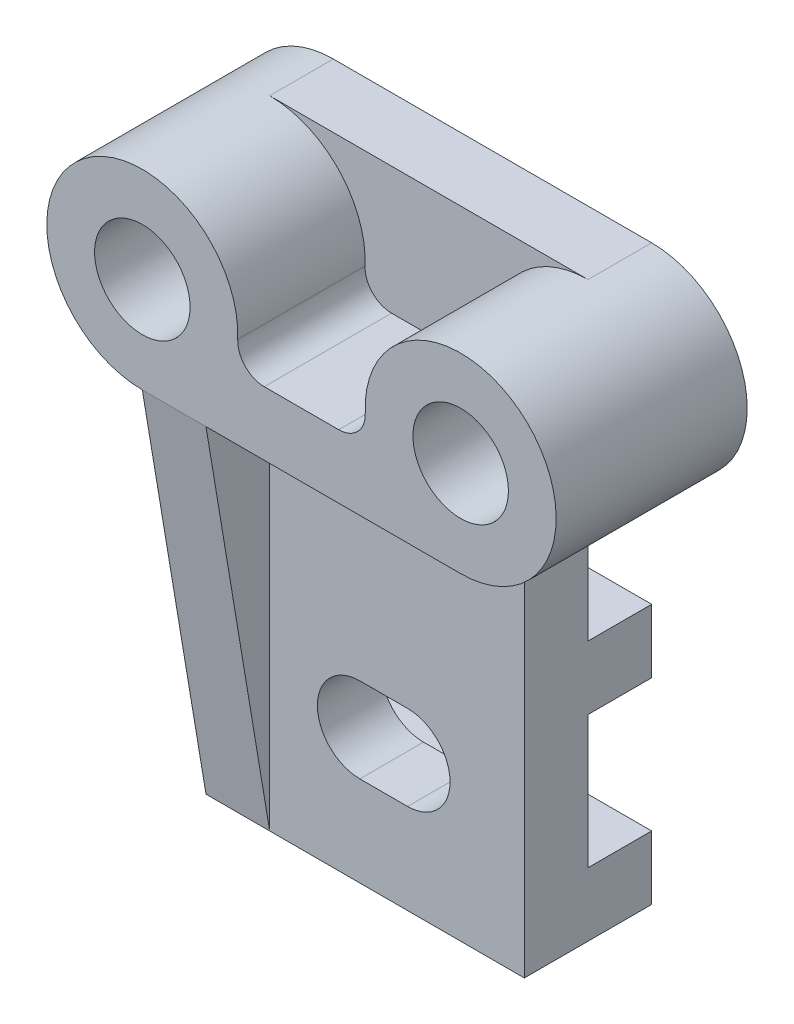
ISO-10303-21;
HEADER;
FILE_DESCRIPTION(('STEP AP214'),'2;1');
FILE_NAME('part.step','',(''),(''),'','','');
FILE_SCHEMA(('AUTOMOTIVE_DESIGN { 1 0 10303 214 1 1 1 1 }'));
ENDSEC;
DATA;
#1=APPLICATION_CONTEXT('core data for automotive mechanical design processes');
#2=APPLICATION_PROTOCOL_DEFINITION('international standard','automotive_design',2000,#1);
#3=PRODUCT_CONTEXT('',#1,'mechanical');
#4=PRODUCT('Part','Part','',(#3));
#5=PRODUCT_RELATED_PRODUCT_CATEGORY('part','',(#4));
#6=PRODUCT_DEFINITION_FORMATION('','',#4);
#7=PRODUCT_DEFINITION_CONTEXT('part definition',#1,'design');
#8=PRODUCT_DEFINITION('design','',#6,#7);
#9=PRODUCT_DEFINITION_SHAPE('','',#8);
#10=(LENGTH_UNIT() NAMED_UNIT(*) SI_UNIT(.MILLI.,.METRE.));
#11=(NAMED_UNIT(*) PLANE_ANGLE_UNIT() SI_UNIT($,.RADIAN.));
#12=(NAMED_UNIT(*) SI_UNIT($,.STERADIAN.) SOLID_ANGLE_UNIT());
#13=UNCERTAINTY_MEASURE_WITH_UNIT(LENGTH_MEASURE(1.E-05),#10,'distance_accuracy_value','');
#14=(GEOMETRIC_REPRESENTATION_CONTEXT(3) GLOBAL_UNCERTAINTY_ASSIGNED_CONTEXT((#13)) GLOBAL_UNIT_ASSIGNED_CONTEXT((#10,
#11,#12)) REPRESENTATION_CONTEXT('',''));
#15=CARTESIAN_POINT('',(0.,0.,0.));
#16=DIRECTION('',(0.,0.,1.));
#17=DIRECTION('',(1.,0.,0.));
#18=AXIS2_PLACEMENT_3D('',#15,#16,#17);
#19=CARTESIAN_POINT('',(0.,27.,36.));
#20=DIRECTION('',(0.,1.,0.));
#21=DIRECTION('',(-1.,0.,0.));
#22=AXIS2_PLACEMENT_3D('',#19,#20,#21);
#23=PLANE('',#22);
#24=DIRECTION('',(0.,0.,-1.));
#25=VECTOR('',#24,1.);
#26=CARTESIAN_POINT('',(-18.,27.,36.));
#27=LINE('',#26,#25);
#28=CARTESIAN_POINT('',(-18.,27.,36.));
#29=VERTEX_POINT('',#28);
#30=CARTESIAN_POINT('',(-18.,27.,24.));
#31=VERTEX_POINT('',#30);
#32=EDGE_CURVE('E411',#29,#31,#27,.T.);
#33=ORIENTED_EDGE('',*,*,#32,.T.);
#34=DIRECTION('',(1.,0.,0.));
#35=VECTOR('',#34,1.);
#36=CARTESIAN_POINT('',(0.,27.,24.));
#37=LINE('',#36,#35);
#38=CARTESIAN_POINT('',(30.,27.,24.));
#39=VERTEX_POINT('',#38);
#40=EDGE_CURVE('E363',#31,#39,#37,.T.);
#41=ORIENTED_EDGE('',*,*,#40,.T.);
#42=DIRECTION('',(0.,0.,-1.));
#43=VECTOR('',#42,1.);
#44=CARTESIAN_POINT('',(30.,27.,36.));
#45=LINE('',#44,#43);
#46=CARTESIAN_POINT('',(30.,27.,36.));
#47=VERTEX_POINT('',#46);
#48=EDGE_CURVE('E279',#47,#39,#45,.T.);
#49=ORIENTED_EDGE('',*,*,#48,.F.);
#50=DIRECTION('',(1.,0.,0.));
#51=VECTOR('',#50,1.);
#52=CARTESIAN_POINT('',(0.,27.,36.));
#53=LINE('',#52,#51);
#54=EDGE_CURVE('E276',#29,#47,#53,.T.);
#55=ORIENTED_EDGE('',*,*,#54,.F.);
#56=EDGE_LOOP('',(#33,#41,#49,#55));
#57=FACE_BOUND('',#56,.T.);
#58=ADVANCED_FACE('F49',(#57),#23,.F.);
#59=CARTESIAN_POINT('',(0.,0.,24.));
#60=DIRECTION('',(0.,0.,1.));
#61=DIRECTION('',(1.,0.,0.));
#62=AXIS2_PLACEMENT_3D('',#59,#60,#61);
#63=PLANE('',#62);
#64=CARTESIAN_POINT('',(-0.999999999999996,-20.,24.));
#65=DIRECTION('',(0.,0.,1.));
#66=DIRECTION('',(1.,0.,0.));
#67=AXIS2_PLACEMENT_3D('',#64,#65,#66);
#68=CIRCLE('',#67,8.);
#69=CARTESIAN_POINT('',(-1.,-12.,24.));
#70=VERTEX_POINT('',#69);
#71=CARTESIAN_POINT('',(-1.,-28.,24.));
#72=VERTEX_POINT('',#71);
#73=EDGE_CURVE('E366',#70,#72,#68,.T.);
#74=ORIENTED_EDGE('',*,*,#73,.F.);
#75=DIRECTION('',(-1.,0.,0.));
#76=VECTOR('',#75,1.);
#77=CARTESIAN_POINT('',(0.,-12.,24.));
#78=LINE('',#77,#76);
#79=CARTESIAN_POINT('',(8.,-12.,24.));
#80=VERTEX_POINT('',#79);
#81=EDGE_CURVE('E369',#80,#70,#78,.T.);
#82=ORIENTED_EDGE('',*,*,#81,.F.);
#83=CARTESIAN_POINT('',(8.,-20.,24.));
#84=DIRECTION('',(0.,0.,1.));
#85=DIRECTION('',(1.,0.,0.));
#86=AXIS2_PLACEMENT_3D('',#83,#84,#85);
#87=CIRCLE('',#86,8.);
#88=CARTESIAN_POINT('',(8.,-28.,24.));
#89=VERTEX_POINT('',#88);
#90=EDGE_CURVE('E373',#89,#80,#87,.T.);
#91=ORIENTED_EDGE('',*,*,#90,.F.);
#92=DIRECTION('',(1.,0.,0.));
#93=VECTOR('',#92,1.);
#94=CARTESIAN_POINT('',(0.,-28.,24.));
#95=LINE('',#94,#93);
#96=EDGE_CURVE('E376',#72,#89,#95,.T.);
#97=ORIENTED_EDGE('',*,*,#96,.F.);
#98=EDGE_LOOP('',(#74,#82,#91,#97));
#99=FACE_BOUND('',#98,.T.);
#100=ORIENTED_EDGE('',*,*,#40,.F.);
#101=DIRECTION('',(0.,1.,0.));
#102=VECTOR('',#101,1.);
#103=CARTESIAN_POINT('',(-18.,0.,24.));
#104=LINE('',#103,#102);
#105=CARTESIAN_POINT('',(-18.,-45.,24.));
#106=VERTEX_POINT('',#105);
#107=EDGE_CURVE('E407',#106,#31,#104,.T.);
#108=ORIENTED_EDGE('',*,*,#107,.F.);
#109=DIRECTION('',(-1.,0.,0.));
#110=VECTOR('',#109,1.);
#111=CARTESIAN_POINT('',(0.,-45.,24.));
#112=LINE('',#111,#110);
#113=CARTESIAN_POINT('',(30.,-45.,24.));
#114=VERTEX_POINT('',#113);
#115=EDGE_CURVE('E224',#114,#106,#112,.T.);
#116=ORIENTED_EDGE('',*,*,#115,.F.);
#117=DIRECTION('',(0.,-1.,0.));
#118=VECTOR('',#117,1.);
#119=CARTESIAN_POINT('',(30.,0.,24.));
#120=LINE('',#119,#118);
#121=EDGE_CURVE('E359',#39,#114,#120,.T.);
#122=ORIENTED_EDGE('',*,*,#121,.F.);
#123=EDGE_LOOP('',(#100,#108,#116,#122));
#124=FACE_BOUND('',#123,.T.);
#125=ADVANCED_FACE('F405',(#99,#124),#63,.T.);
#126=CARTESIAN_POINT('',(0.,0.,0.));
#127=DIRECTION('',(0.,0.,1.));
#128=DIRECTION('',(1.,0.,0.));
#129=AXIS2_PLACEMENT_3D('',#126,#127,#128);
#130=PLANE('',#129);
#131=DIRECTION('',(-1.,0.,0.));
#132=VECTOR('',#131,1.);
#133=CARTESIAN_POINT('',(0.,-8.,0.));
#134=LINE('',#133,#132);
#135=CARTESIAN_POINT('',(30.,-8.,0.));
#136=VERTEX_POINT('',#135);
#137=CARTESIAN_POINT('',(-30.,-8.00000000000001,0.));
#138=VERTEX_POINT('',#137);
#139=EDGE_CURVE('E421',#136,#138,#134,.T.);
#140=ORIENTED_EDGE('',*,*,#139,.T.);
#141=DIRECTION('',(0.,-1.,0.));
#142=VECTOR('',#141,1.);
#143=CARTESIAN_POINT('',(-30.,0.,0.));
#144=LINE('',#143,#142);
#145=CARTESIAN_POINT('',(-30.,4.,0.));
#146=VERTEX_POINT('',#145);
#147=EDGE_CURVE('E380',#146,#138,#144,.T.);
#148=ORIENTED_EDGE('',*,*,#147,.F.);
#149=DIRECTION('',(1.,0.,0.));
#150=VECTOR('',#149,1.);
#151=CARTESIAN_POINT('',(0.,4.,0.));
#152=LINE('',#151,#150);
#153=CARTESIAN_POINT('',(30.,4.,0.));
#154=VERTEX_POINT('',#153);
#155=EDGE_CURVE('E413',#146,#154,#152,.T.);
#156=ORIENTED_EDGE('',*,*,#155,.T.);
#157=DIRECTION('',(0.,-1.,0.));
#158=VECTOR('',#157,1.);
#159=CARTESIAN_POINT('',(30.,0.,0.));
#160=LINE('',#159,#158);
#161=EDGE_CURVE('E360',#154,#136,#160,.T.);
#162=ORIENTED_EDGE('',*,*,#161,.T.);
#163=EDGE_LOOP('',(#140,#148,#156,#162));
#164=FACE_BOUND('',#163,.T.);
#165=ADVANCED_FACE('F466',(#164),#130,.F.);
#166=CARTESIAN_POINT('',(-30.,-33.,0.));
#167=VERTEX_POINT('',#166);
#168=CARTESIAN_POINT('',(-30.,-45.,0.));
#169=VERTEX_POINT('',#168);
#170=EDGE_CURVE('E229',#167,#169,#144,.T.);
#171=ORIENTED_EDGE('',*,*,#170,.F.);
#172=DIRECTION('',(-1.,0.,0.));
#173=VECTOR('',#172,1.);
#174=CARTESIAN_POINT('',(0.,-33.,0.));
#175=LINE('',#174,#173);
#176=CARTESIAN_POINT('',(30.,-33.,0.));
#177=VERTEX_POINT('',#176);
#178=EDGE_CURVE('E356',#177,#167,#175,.T.);
#179=ORIENTED_EDGE('',*,*,#178,.F.);
#180=CARTESIAN_POINT('',(30.,-45.,0.));
#181=VERTEX_POINT('',#180);
#182=EDGE_CURVE('E384',#177,#181,#160,.T.);
#183=ORIENTED_EDGE('',*,*,#182,.T.);
#184=DIRECTION('',(-1.,0.,0.));
#185=VECTOR('',#184,1.);
#186=CARTESIAN_POINT('',(0.,-45.,0.));
#187=LINE('',#186,#185);
#188=EDGE_CURVE('E382',#181,#169,#187,.T.);
#189=ORIENTED_EDGE('',*,*,#188,.T.);
#190=EDGE_LOOP('',(#171,#179,#183,#189));
#191=FACE_BOUND('',#190,.T.);
#192=ADVANCED_FACE('F479',(#191),#130,.F.);
#193=CARTESIAN_POINT('',(-30.,0.,24.));
#194=DIRECTION('',(1.,0.,0.));
#195=DIRECTION('',(0.,1.,0.));
#196=AXIS2_PLACEMENT_3D('',#193,#194,#195);
#197=PLANE('',#196);
#198=DIRECTION('',(0.,0.,-1.));
#199=VECTOR('',#198,1.);
#200=CARTESIAN_POINT('',(-30.,-45.,24.));
#201=LINE('',#200,#199);
#202=CARTESIAN_POINT('',(-30.,-45.,24.));
#203=VERTEX_POINT('',#202);
#204=EDGE_CURVE('E221',#203,#169,#201,.T.);
#205=ORIENTED_EDGE('',*,*,#204,.F.);
#206=DIRECTION('',(0.,0.986393923832144,0.164398987305357));
#207=VECTOR('',#206,1.);
#208=CARTESIAN_POINT('',(-30.,-5.10810810810811,30.6486486486487));
#209=LINE('',#208,#207);
#210=CARTESIAN_POINT('',(-30.,27.,36.));
#211=VERTEX_POINT('',#210);
#212=EDGE_CURVE('E205',#203,#211,#209,.T.);
#213=ORIENTED_EDGE('',*,*,#212,.T.);
#214=DIRECTION('',(0.,0.,-1.));
#215=VECTOR('',#214,1.);
#216=CARTESIAN_POINT('',(-30.,27.,36.));
#217=LINE('',#216,#215);
#218=CARTESIAN_POINT('',(-30.,27.,12.));
#219=VERTEX_POINT('',#218);
#220=EDGE_CURVE('E292',#211,#219,#217,.T.);
#221=ORIENTED_EDGE('',*,*,#220,.T.);
#222=DIRECTION('',(0.,-1.,0.));
#223=VECTOR('',#222,1.);
#224=CARTESIAN_POINT('',(-30.,0.,12.));
#225=LINE('',#224,#223);
#226=CARTESIAN_POINT('',(-30.,4.,12.));
#227=VERTEX_POINT('',#226);
#228=EDGE_CURVE('E448',#219,#227,#225,.T.);
#229=ORIENTED_EDGE('',*,*,#228,.T.);
#230=DIRECTION('',(0.,0.,-1.));
#231=VECTOR('',#230,1.);
#232=CARTESIAN_POINT('',(-30.,4.,12.));
#233=LINE('',#232,#231);
#234=EDGE_CURVE('E353',#227,#146,#233,.T.);
#235=ORIENTED_EDGE('',*,*,#234,.T.);
#236=ORIENTED_EDGE('',*,*,#147,.T.);
#237=DIRECTION('',(0.,0.,-1.));
#238=VECTOR('',#237,1.);
#239=CARTESIAN_POINT('',(-30.,-8.00000000000001,12.));
#240=LINE('',#239,#238);
#241=CARTESIAN_POINT('',(-30.,-8.00000000000001,12.));
#242=VERTEX_POINT('',#241);
#243=EDGE_CURVE('E442',#242,#138,#240,.T.);
#244=ORIENTED_EDGE('',*,*,#243,.F.);
#245=DIRECTION('',(0.,-1.,0.));
#246=VECTOR('',#245,1.);
#247=CARTESIAN_POINT('',(-30.,0.,12.));
#248=LINE('',#247,#246);
#249=CARTESIAN_POINT('',(-30.,-33.,12.));
#250=VERTEX_POINT('',#249);
#251=EDGE_CURVE('E426',#242,#250,#248,.T.);
#252=ORIENTED_EDGE('',*,*,#251,.T.);
#253=DIRECTION('',(0.,0.,-1.));
#254=VECTOR('',#253,1.);
#255=CARTESIAN_POINT('',(-30.,-33.,12.));
#256=LINE('',#255,#254);
#257=EDGE_CURVE('E437',#250,#167,#256,.T.);
#258=ORIENTED_EDGE('',*,*,#257,.T.);
#259=ORIENTED_EDGE('',*,*,#170,.T.);
#260=EDGE_LOOP('',(#205,#213,#221,#229,#235,#236,#244,#252,#258,#259));
#261=FACE_BOUND('',#260,.T.);
#262=ADVANCED_FACE('F226',(#261),#197,.F.);
#263=CARTESIAN_POINT('',(30.,0.,24.));
#264=DIRECTION('',(1.,0.,0.));
#265=DIRECTION('',(0.,1.,0.));
#266=AXIS2_PLACEMENT_3D('',#263,#264,#265);
#267=PLANE('',#266);
#268=DIRECTION('',(0.,0.,-1.));
#269=VECTOR('',#268,1.);
#270=CARTESIAN_POINT('',(30.,-33.,12.));
#271=LINE('',#270,#269);
#272=CARTESIAN_POINT('',(30.,-33.,12.));
#273=VERTEX_POINT('',#272);
#274=EDGE_CURVE('E381',#273,#177,#271,.T.);
#275=ORIENTED_EDGE('',*,*,#274,.F.);
#276=DIRECTION('',(0.,-1.,0.));
#277=VECTOR('',#276,1.);
#278=CARTESIAN_POINT('',(30.,0.,12.));
#279=LINE('',#278,#277);
#280=CARTESIAN_POINT('',(30.,-8.,12.));
#281=VERTEX_POINT('',#280);
#282=EDGE_CURVE('E420',#281,#273,#279,.T.);
#283=ORIENTED_EDGE('',*,*,#282,.F.);
#284=DIRECTION('',(0.,0.,-1.));
#285=VECTOR('',#284,1.);
#286=CARTESIAN_POINT('',(30.,-8.,12.));
#287=LINE('',#286,#285);
#288=EDGE_CURVE('E444',#281,#136,#287,.T.);
#289=ORIENTED_EDGE('',*,*,#288,.T.);
#290=ORIENTED_EDGE('',*,*,#161,.F.);
#291=DIRECTION('',(0.,0.,-1.));
#292=VECTOR('',#291,1.);
#293=CARTESIAN_POINT('',(30.,4.,12.));
#294=LINE('',#293,#292);
#295=CARTESIAN_POINT('',(30.,4.,12.));
#296=VERTEX_POINT('',#295);
#297=EDGE_CURVE('E345',#296,#154,#294,.T.);
#298=ORIENTED_EDGE('',*,*,#297,.F.);
#299=DIRECTION('',(0.,-1.,0.));
#300=VECTOR('',#299,1.);
#301=CARTESIAN_POINT('',(30.,0.,12.));
#302=LINE('',#301,#300);
#303=CARTESIAN_POINT('',(30.,27.,12.));
#304=VERTEX_POINT('',#303);
#305=EDGE_CURVE('E347',#304,#296,#302,.T.);
#306=ORIENTED_EDGE('',*,*,#305,.F.);
#307=DIRECTION('',(0.,0.,-1.));
#308=VECTOR('',#307,1.);
#309=CARTESIAN_POINT('',(30.,27.,24.));
#310=LINE('',#309,#308);
#311=EDGE_CURVE('E238',#39,#304,#310,.T.);
#312=ORIENTED_EDGE('',*,*,#311,.F.);
#313=ORIENTED_EDGE('',*,*,#121,.T.);
#314=DIRECTION('',(0.,0.,-1.));
#315=VECTOR('',#314,1.);
#316=CARTESIAN_POINT('',(30.,-45.,24.));
#317=LINE('',#316,#315);
#318=EDGE_CURVE('E232',#114,#181,#317,.T.);
#319=ORIENTED_EDGE('',*,*,#318,.T.);
#320=ORIENTED_EDGE('',*,*,#182,.F.);
#321=EDGE_LOOP('',(#275,#283,#289,#290,#298,#306,#312,#313,#319,#320));
#322=FACE_BOUND('',#321,.T.);
#323=ADVANCED_FACE('F400',(#322),#267,.T.);
#324=CARTESIAN_POINT('',(30.,45.,36.));
#325=DIRECTION('',(0.,0.,-1.));
#326=DIRECTION('',(-1.,0.,0.));
#327=AXIS2_PLACEMENT_3D('',#324,#325,#326);
#328=CYLINDRICAL_SURFACE('',#327,18.);
#329=CARTESIAN_POINT('',(30.,45.,12.));
#330=DIRECTION('',(0.,0.,1.));
#331=DIRECTION('',(1.,0.,0.));
#332=AXIS2_PLACEMENT_3D('',#329,#330,#331);
#333=CIRCLE('',#332,18.);
#334=CARTESIAN_POINT('',(30.,63.,12.));
#335=VERTEX_POINT('',#334);
#336=CARTESIAN_POINT('',(12.0170212804027,44.2173913043478,12.));
#337=VERTEX_POINT('',#336);
#338=EDGE_CURVE('E242',#335,#337,#333,.T.);
#339=ORIENTED_EDGE('',*,*,#338,.T.);
#340=DIRECTION('',(0.,0.,-1.));
#341=VECTOR('',#340,1.);
#342=CARTESIAN_POINT('',(12.0170212804027,44.2173913043478,36.));
#343=LINE('',#342,#341);
#344=CARTESIAN_POINT('',(12.0170212804027,44.2173913043478,36.));
#345=VERTEX_POINT('',#344);
#346=EDGE_CURVE('E64',#337,#345,#343,.F.);
#347=ORIENTED_EDGE('',*,*,#346,.T.);
#348=CARTESIAN_POINT('',(30.,45.,36.));
#349=DIRECTION('',(0.,0.,1.));
#350=DIRECTION('',(1.,0.,0.));
#351=AXIS2_PLACEMENT_3D('',#348,#349,#350);
#352=CIRCLE('',#351,18.);
#353=EDGE_CURVE('E270',#47,#345,#352,.T.);
#354=ORIENTED_EDGE('',*,*,#353,.F.);
#355=ORIENTED_EDGE('',*,*,#48,.T.);
#356=ORIENTED_EDGE('',*,*,#311,.T.);
#357=DIRECTION('',(0.,0.,-1.));
#358=VECTOR('',#357,1.);
#359=CARTESIAN_POINT('',(30.,27.,12.));
#360=LINE('',#359,#358);
#361=CARTESIAN_POINT('',(30.,27.,0.));
#362=VERTEX_POINT('',#361);
#363=EDGE_CURVE('E342',#304,#362,#360,.T.);
#364=ORIENTED_EDGE('',*,*,#363,.T.);
#365=CARTESIAN_POINT('',(30.,45.,0.));
#366=DIRECTION('',(0.,0.,1.));
#367=DIRECTION('',(1.,0.,0.));
#368=AXIS2_PLACEMENT_3D('',#365,#366,#367);
#369=CIRCLE('',#368,18.);
#370=CARTESIAN_POINT('',(30.,63.,0.));
#371=VERTEX_POINT('',#370);
#372=EDGE_CURVE('E285',#362,#371,#369,.T.);
#373=ORIENTED_EDGE('',*,*,#372,.T.);
#374=DIRECTION('',(0.,0.,-1.));
#375=VECTOR('',#374,1.);
#376=CARTESIAN_POINT('',(30.,63.,12.));
#377=LINE('',#376,#375);
#378=EDGE_CURVE('E259',#335,#371,#377,.T.);
#379=ORIENTED_EDGE('',*,*,#378,.F.);
#380=EDGE_LOOP('',(#339,#347,#354,#355,#356,#364,#373,#379));
#381=FACE_BOUND('',#380,.T.);
#382=ADVANCED_FACE('F327',(#381),#328,.T.);
#383=CARTESIAN_POINT('',(0.,39.,36.));
#384=DIRECTION('',(0.,1.,0.));
#385=DIRECTION('',(0.,0.,1.));
#386=AXIS2_PLACEMENT_3D('',#383,#384,#385);
#387=PLANE('',#386);
#388=DIRECTION('',(1.,0.,0.));
#389=VECTOR('',#388,1.);
#390=CARTESIAN_POINT('',(0.,39.,12.));
#391=LINE('',#390,#389);
#392=CARTESIAN_POINT('',(-7.02174941384788,39.,12.));
#393=VERTEX_POINT('',#392);
#394=CARTESIAN_POINT('',(7.02174941384787,39.,12.));
#395=VERTEX_POINT('',#394);
#396=EDGE_CURVE('E250',#393,#395,#391,.T.);
#397=ORIENTED_EDGE('',*,*,#396,.F.);
#398=DIRECTION('',(0.,0.,-1.));
#399=VECTOR('',#398,1.);
#400=CARTESIAN_POINT('',(-7.02174941384788,39.,36.));
#401=LINE('',#400,#399);
#402=CARTESIAN_POINT('',(-7.02174941384788,39.,36.));
#403=VERTEX_POINT('',#402);
#404=EDGE_CURVE('E304',#393,#403,#401,.F.);
#405=ORIENTED_EDGE('',*,*,#404,.T.);
#406=DIRECTION('',(1.,0.,0.));
#407=VECTOR('',#406,1.);
#408=CARTESIAN_POINT('',(0.,39.,36.));
#409=LINE('',#408,#407);
#410=CARTESIAN_POINT('',(7.02174941384787,39.,36.));
#411=VERTEX_POINT('',#410);
#412=EDGE_CURVE('E272',#403,#411,#409,.T.);
#413=ORIENTED_EDGE('',*,*,#412,.T.);
#414=DIRECTION('',(0.,0.,-1.));
#415=VECTOR('',#414,1.);
#416=CARTESIAN_POINT('',(7.02174941384787,39.,36.));
#417=LINE('',#416,#415);
#418=EDGE_CURVE('E301',#411,#395,#417,.T.);
#419=ORIENTED_EDGE('',*,*,#418,.T.);
#420=EDGE_LOOP('',(#397,#405,#413,#419));
#421=FACE_BOUND('',#420,.T.);
#422=ADVANCED_FACE('F323',(#421),#387,.T.);
#423=CARTESIAN_POINT('',(-30.,45.,36.));
#424=DIRECTION('',(0.,0.,-1.));
#425=DIRECTION('',(-1.,0.,0.));
#426=AXIS2_PLACEMENT_3D('',#423,#424,#425);
#427=CYLINDRICAL_SURFACE('',#426,18.);
#428=CARTESIAN_POINT('',(-30.,45.,36.));
#429=DIRECTION('',(0.,0.,1.));
#430=DIRECTION('',(1.,0.,0.));
#431=AXIS2_PLACEMENT_3D('',#428,#429,#430);
#432=CIRCLE('',#431,18.);
#433=CARTESIAN_POINT('',(-12.0170212804027,44.2173913043478,36.));
#434=VERTEX_POINT('',#433);
#435=EDGE_CURVE('E274',#434,#211,#432,.T.);
#436=ORIENTED_EDGE('',*,*,#435,.F.);
#437=DIRECTION('',(0.,0.,-1.));
#438=VECTOR('',#437,1.);
#439=CARTESIAN_POINT('',(-12.0170212804027,44.2173913043478,36.));
#440=LINE('',#439,#438);
#441=CARTESIAN_POINT('',(-12.0170212804027,44.2173913043478,12.));
#442=VERTEX_POINT('',#441);
#443=EDGE_CURVE('E294',#434,#442,#440,.T.);
#444=ORIENTED_EDGE('',*,*,#443,.T.);
#445=CARTESIAN_POINT('',(-30.,45.,12.));
#446=DIRECTION('',(0.,0.,1.));
#447=DIRECTION('',(1.,0.,0.));
#448=AXIS2_PLACEMENT_3D('',#445,#446,#447);
#449=CIRCLE('',#448,18.);
#450=CARTESIAN_POINT('',(-30.,63.,12.));
#451=VERTEX_POINT('',#450);
#452=EDGE_CURVE('E248',#442,#451,#449,.T.);
#453=ORIENTED_EDGE('',*,*,#452,.T.);
#454=DIRECTION('',(0.,0.,-1.));
#455=VECTOR('',#454,1.);
#456=CARTESIAN_POINT('',(-30.,63.,12.));
#457=LINE('',#456,#455);
#458=CARTESIAN_POINT('',(-30.,63.,0.));
#459=VERTEX_POINT('',#458);
#460=EDGE_CURVE('E253',#451,#459,#457,.T.);
#461=ORIENTED_EDGE('',*,*,#460,.T.);
#462=CARTESIAN_POINT('',(-30.,45.,0.));
#463=DIRECTION('',(0.,0.,1.));
#464=DIRECTION('',(1.,0.,0.));
#465=AXIS2_PLACEMENT_3D('',#462,#463,#464);
#466=CIRCLE('',#465,18.);
#467=CARTESIAN_POINT('',(-30.,27.,0.));
#468=VERTEX_POINT('',#467);
#469=EDGE_CURVE('E266',#459,#468,#466,.T.);
#470=ORIENTED_EDGE('',*,*,#469,.T.);
#471=DIRECTION('',(0.,0.,-1.));
#472=VECTOR('',#471,1.);
#473=CARTESIAN_POINT('',(-30.,27.,12.));
#474=LINE('',#473,#472);
#475=EDGE_CURVE('E339',#219,#468,#474,.T.);
#476=ORIENTED_EDGE('',*,*,#475,.F.);
#477=ORIENTED_EDGE('',*,*,#220,.F.);
#478=EDGE_LOOP('',(#436,#444,#453,#461,#470,#476,#477));
#479=FACE_BOUND('',#478,.T.);
#480=ADVANCED_FACE('F314',(#479),#427,.T.);
#481=CARTESIAN_POINT('',(30.,45.,36.));
#482=DIRECTION('',(0.,0.,-1.));
#483=DIRECTION('',(-1.,0.,0.));
#484=AXIS2_PLACEMENT_3D('',#481,#482,#483);
#485=CYLINDRICAL_SURFACE('',#484,9.);
#486=CARTESIAN_POINT('',(30.,45.,36.));
#487=DIRECTION('',(0.,0.,1.));
#488=DIRECTION('',(1.,0.,0.));
#489=AXIS2_PLACEMENT_3D('',#486,#487,#488);
#490=CIRCLE('',#489,9.);
#491=CARTESIAN_POINT('',(39.,45.,36.));
#492=VERTEX_POINT('',#491);
#493=EDGE_CURVE('E265',#492,#492,#490,.T.);
#494=ORIENTED_EDGE('',*,*,#493,.T.);
#495=EDGE_LOOP('',(#494));
#496=FACE_BOUND('',#495,.T.);
#497=CARTESIAN_POINT('',(30.,45.,0.));
#498=DIRECTION('',(0.,0.,1.));
#499=DIRECTION('',(1.,0.,0.));
#500=AXIS2_PLACEMENT_3D('',#497,#498,#499);
#501=CIRCLE('',#500,9.);
#502=CARTESIAN_POINT('',(39.,45.,0.));
#503=VERTEX_POINT('',#502);
#504=EDGE_CURVE('E282',#503,#503,#501,.T.);
#505=ORIENTED_EDGE('',*,*,#504,.F.);
#506=EDGE_LOOP('',(#505));
#507=FACE_BOUND('',#506,.T.);
#508=ADVANCED_FACE('F507',(#496,#507),#485,.F.);
#509=CARTESIAN_POINT('',(-30.,45.,36.));
#510=DIRECTION('',(0.,0.,-1.));
#511=DIRECTION('',(-1.,0.,0.));
#512=AXIS2_PLACEMENT_3D('',#509,#510,#511);
#513=CYLINDRICAL_SURFACE('',#512,9.00000000000001);
#514=CARTESIAN_POINT('',(-30.,45.,36.));
#515=DIRECTION('',(0.,0.,1.));
#516=DIRECTION('',(1.,0.,0.));
#517=AXIS2_PLACEMENT_3D('',#514,#515,#516);
#518=CIRCLE('',#517,9.00000000000001);
#519=CARTESIAN_POINT('',(-21.,45.,36.));
#520=VERTEX_POINT('',#519);
#521=EDGE_CURVE('E262',#520,#520,#518,.T.);
#522=ORIENTED_EDGE('',*,*,#521,.T.);
#523=EDGE_LOOP('',(#522));
#524=FACE_BOUND('',#523,.T.);
#525=CARTESIAN_POINT('',(-30.,45.,0.));
#526=DIRECTION('',(0.,0.,1.));
#527=DIRECTION('',(1.,0.,0.));
#528=AXIS2_PLACEMENT_3D('',#525,#526,#527);
#529=CIRCLE('',#528,9.00000000000001);
#530=CARTESIAN_POINT('',(-21.,45.,0.));
#531=VERTEX_POINT('',#530);
#532=EDGE_CURVE('E261',#531,#531,#529,.T.);
#533=ORIENTED_EDGE('',*,*,#532,.F.);
#534=EDGE_LOOP('',(#533));
#535=FACE_BOUND('',#534,.T.);
#536=ADVANCED_FACE('F514',(#524,#535),#513,.F.);
#537=CARTESIAN_POINT('',(0.,0.,36.));
#538=DIRECTION('',(0.,0.,1.));
#539=DIRECTION('',(1.,0.,0.));
#540=AXIS2_PLACEMENT_3D('',#537,#538,#539);
#541=PLANE('',#540);
#542=DIRECTION('',(1.,0.,0.));
#543=VECTOR('',#542,1.);
#544=CARTESIAN_POINT('',(-30.,27.,36.));
#545=LINE('',#544,#543);
#546=EDGE_CURVE('E211',#211,#29,#545,.T.);
#547=ORIENTED_EDGE('',*,*,#546,.T.);
#548=ORIENTED_EDGE('',*,*,#54,.T.);
#549=ORIENTED_EDGE('',*,*,#353,.T.);
#550=CARTESIAN_POINT('',(7.02174941384787,44.,36.));
#551=DIRECTION('',(0.,0.,1.));
#552=DIRECTION('',(1.,0.,0.));
#553=AXIS2_PLACEMENT_3D('',#550,#551,#552);
#554=CIRCLE('',#553,5.);
#555=EDGE_CURVE('E11',#345,#411,#554,.F.);
#556=ORIENTED_EDGE('',*,*,#555,.T.);
#557=ORIENTED_EDGE('',*,*,#412,.F.);
#558=CARTESIAN_POINT('',(-7.02174941384788,44.,36.));
#559=DIRECTION('',(0.,0.,1.));
#560=DIRECTION('',(1.,0.,0.));
#561=AXIS2_PLACEMENT_3D('',#558,#559,#560);
#562=CIRCLE('',#561,5.);
#563=EDGE_CURVE('E57',#403,#434,#562,.F.);
#564=ORIENTED_EDGE('',*,*,#563,.T.);
#565=ORIENTED_EDGE('',*,*,#435,.T.);
#566=EDGE_LOOP('',(#547,#548,#549,#556,#557,#564,#565));
#567=FACE_BOUND('',#566,.T.);
#568=ORIENTED_EDGE('',*,*,#521,.F.);
#569=EDGE_LOOP('',(#568));
#570=FACE_BOUND('',#569,.T.);
#571=ORIENTED_EDGE('',*,*,#493,.F.);
#572=EDGE_LOOP('',(#571));
#573=FACE_BOUND('',#572,.T.);
#574=ADVANCED_FACE('F308',(#567,#570,#573),#541,.T.);
#575=ORIENTED_EDGE('',*,*,#372,.F.);
#576=DIRECTION('',(1.,0.,0.));
#577=VECTOR('',#576,1.);
#578=CARTESIAN_POINT('',(0.,27.,0.));
#579=LINE('',#578,#577);
#580=EDGE_CURVE('E338',#468,#362,#579,.T.);
#581=ORIENTED_EDGE('',*,*,#580,.F.);
#582=ORIENTED_EDGE('',*,*,#469,.F.);
#583=DIRECTION('',(1.,0.,0.));
#584=VECTOR('',#583,1.);
#585=CARTESIAN_POINT('',(0.,63.,0.));
#586=LINE('',#585,#584);
#587=EDGE_CURVE('E245',#459,#371,#586,.T.);
#588=ORIENTED_EDGE('',*,*,#587,.T.);
#589=EDGE_LOOP('',(#575,#581,#582,#588));
#590=FACE_BOUND('',#589,.T.);
#591=ORIENTED_EDGE('',*,*,#532,.T.);
#592=EDGE_LOOP('',(#591));
#593=FACE_BOUND('',#592,.T.);
#594=ORIENTED_EDGE('',*,*,#504,.T.);
#595=EDGE_LOOP('',(#594));
#596=FACE_BOUND('',#595,.T.);
#597=ADVANCED_FACE('F335',(#590,#593,#596),#130,.F.);
#598=CARTESIAN_POINT('',(0.,63.,12.));
#599=DIRECTION('',(0.,1.,0.));
#600=DIRECTION('',(-1.,0.,0.));
#601=AXIS2_PLACEMENT_3D('',#598,#599,#600);
#602=PLANE('',#601);
#603=ORIENTED_EDGE('',*,*,#587,.F.);
#604=ORIENTED_EDGE('',*,*,#460,.F.);
#605=DIRECTION('',(1.,0.,0.));
#606=VECTOR('',#605,1.);
#607=CARTESIAN_POINT('',(0.,63.,12.));
#608=LINE('',#607,#606);
#609=EDGE_CURVE('E244',#451,#335,#608,.T.);
#610=ORIENTED_EDGE('',*,*,#609,.T.);
#611=ORIENTED_EDGE('',*,*,#378,.T.);
#612=EDGE_LOOP('',(#603,#604,#610,#611));
#613=FACE_BOUND('',#612,.T.);
#614=ADVANCED_FACE('F331',(#613),#602,.T.);
#615=CARTESIAN_POINT('',(0.,0.,12.));
#616=DIRECTION('',(0.,0.,1.));
#617=DIRECTION('',(1.,0.,0.));
#618=AXIS2_PLACEMENT_3D('',#615,#616,#617);
#619=PLANE('',#618);
#620=ORIENTED_EDGE('',*,*,#452,.F.);
#621=CARTESIAN_POINT('',(-7.02174941384788,44.,12.));
#622=DIRECTION('',(0.,0.,1.));
#623=DIRECTION('',(1.,0.,0.));
#624=AXIS2_PLACEMENT_3D('',#621,#622,#623);
#625=CIRCLE('',#624,5.);
#626=EDGE_CURVE('E299',#442,#393,#625,.T.);
#627=ORIENTED_EDGE('',*,*,#626,.T.);
#628=ORIENTED_EDGE('',*,*,#396,.T.);
#629=CARTESIAN_POINT('',(7.02174941384787,44.,12.));
#630=DIRECTION('',(0.,0.,1.));
#631=DIRECTION('',(1.,0.,0.));
#632=AXIS2_PLACEMENT_3D('',#629,#630,#631);
#633=CIRCLE('',#632,5.);
#634=EDGE_CURVE('E297',#395,#337,#633,.T.);
#635=ORIENTED_EDGE('',*,*,#634,.T.);
#636=ORIENTED_EDGE('',*,*,#338,.F.);
#637=ORIENTED_EDGE('',*,*,#609,.F.);
#638=EDGE_LOOP('',(#620,#627,#628,#635,#636,#637));
#639=FACE_BOUND('',#638,.T.);
#640=ADVANCED_FACE('F320',(#639),#619,.T.);
#641=CARTESIAN_POINT('',(-0.999999999999996,-20.,24.));
#642=DIRECTION('',(0.,0.,-1.));
#643=DIRECTION('',(-1.,0.,0.));
#644=AXIS2_PLACEMENT_3D('',#641,#642,#643);
#645=CYLINDRICAL_SURFACE('',#644,8.);
#646=CARTESIAN_POINT('',(-0.999999999999996,-20.,12.));
#647=DIRECTION('',(0.,0.,1.));
#648=DIRECTION('',(1.,0.,0.));
#649=AXIS2_PLACEMENT_3D('',#646,#647,#648);
#650=CIRCLE('',#649,8.);
#651=CARTESIAN_POINT('',(-1.,-12.,12.));
#652=VERTEX_POINT('',#651);
#653=CARTESIAN_POINT('',(-1.,-28.,12.));
#654=VERTEX_POINT('',#653);
#655=EDGE_CURVE('E429',#652,#654,#650,.T.);
#656=ORIENTED_EDGE('',*,*,#655,.F.);
#657=DIRECTION('',(0.,0.,-1.));
#658=VECTOR('',#657,1.);
#659=CARTESIAN_POINT('',(-1.,-12.,24.));
#660=LINE('',#659,#658);
#661=EDGE_CURVE('E256',#70,#652,#660,.T.);
#662=ORIENTED_EDGE('',*,*,#661,.F.);
#663=ORIENTED_EDGE('',*,*,#73,.T.);
#664=DIRECTION('',(0.,0.,-1.));
#665=VECTOR('',#664,1.);
#666=CARTESIAN_POINT('',(-1.,-28.,24.));
#667=LINE('',#666,#665);
#668=EDGE_CURVE('E231',#72,#654,#667,.T.);
#669=ORIENTED_EDGE('',*,*,#668,.T.);
#670=EDGE_LOOP('',(#656,#662,#663,#669));
#671=FACE_BOUND('',#670,.T.);
#672=ADVANCED_FACE('F549',(#671),#645,.F.);
#673=CARTESIAN_POINT('',(0.,-12.,24.));
#674=DIRECTION('',(0.,-1.,0.));
#675=DIRECTION('',(0.,0.,-1.));
#676=AXIS2_PLACEMENT_3D('',#673,#674,#675);
#677=PLANE('',#676);
#678=DIRECTION('',(-1.,0.,0.));
#679=VECTOR('',#678,1.);
#680=CARTESIAN_POINT('',(0.,-12.,12.));
#681=LINE('',#680,#679);
#682=CARTESIAN_POINT('',(8.,-12.,12.));
#683=VERTEX_POINT('',#682);
#684=EDGE_CURVE('E431',#683,#652,#681,.T.);
#685=ORIENTED_EDGE('',*,*,#684,.F.);
#686=DIRECTION('',(0.,0.,-1.));
#687=VECTOR('',#686,1.);
#688=CARTESIAN_POINT('',(8.,-12.,24.));
#689=LINE('',#688,#687);
#690=EDGE_CURVE('E388',#80,#683,#689,.T.);
#691=ORIENTED_EDGE('',*,*,#690,.F.);
#692=ORIENTED_EDGE('',*,*,#81,.T.);
#693=ORIENTED_EDGE('',*,*,#661,.T.);
#694=EDGE_LOOP('',(#685,#691,#692,#693));
#695=FACE_BOUND('',#694,.T.);
#696=ADVANCED_FACE('F545',(#695),#677,.T.);
#697=CARTESIAN_POINT('',(8.,-20.,24.));
#698=DIRECTION('',(0.,0.,-1.));
#699=DIRECTION('',(-1.,0.,0.));
#700=AXIS2_PLACEMENT_3D('',#697,#698,#699);
#701=CYLINDRICAL_SURFACE('',#700,8.);
#702=CARTESIAN_POINT('',(8.,-20.,12.));
#703=DIRECTION('',(0.,0.,1.));
#704=DIRECTION('',(1.,0.,0.));
#705=AXIS2_PLACEMENT_3D('',#702,#703,#704);
#706=CIRCLE('',#705,8.);
#707=CARTESIAN_POINT('',(8.,-28.,12.));
#708=VERTEX_POINT('',#707);
#709=EDGE_CURVE('E433',#708,#683,#706,.T.);
#710=ORIENTED_EDGE('',*,*,#709,.F.);
#711=DIRECTION('',(0.,0.,-1.));
#712=VECTOR('',#711,1.);
#713=CARTESIAN_POINT('',(8.,-28.,24.));
#714=LINE('',#713,#712);
#715=EDGE_CURVE('E235',#89,#708,#714,.T.);
#716=ORIENTED_EDGE('',*,*,#715,.F.);
#717=ORIENTED_EDGE('',*,*,#90,.T.);
#718=ORIENTED_EDGE('',*,*,#690,.T.);
#719=EDGE_LOOP('',(#710,#716,#717,#718));
#720=FACE_BOUND('',#719,.T.);
#721=ADVANCED_FACE('F542',(#720),#701,.F.);
#722=CARTESIAN_POINT('',(0.,-45.,24.));
#723=DIRECTION('',(0.,-1.,0.));
#724=DIRECTION('',(0.,0.,-1.));
#725=AXIS2_PLACEMENT_3D('',#722,#723,#724);
#726=PLANE('',#725);
#727=DIRECTION('',(1.,0.,0.));
#728=VECTOR('',#727,1.);
#729=CARTESIAN_POINT('',(-30.,-45.,24.));
#730=LINE('',#729,#728);
#731=EDGE_CURVE('E208',#203,#106,#730,.T.);
#732=ORIENTED_EDGE('',*,*,#731,.F.);
#733=ORIENTED_EDGE('',*,*,#204,.T.);
#734=ORIENTED_EDGE('',*,*,#188,.F.);
#735=ORIENTED_EDGE('',*,*,#318,.F.);
#736=ORIENTED_EDGE('',*,*,#115,.T.);
#737=EDGE_LOOP('',(#732,#733,#734,#735,#736));
#738=FACE_BOUND('',#737,.T.);
#739=ADVANCED_FACE('F219',(#738),#726,.T.);
#740=CARTESIAN_POINT('',(0.,-28.,24.));
#741=DIRECTION('',(0.,1.,0.));
#742=DIRECTION('',(0.,0.,1.));
#743=AXIS2_PLACEMENT_3D('',#740,#741,#742);
#744=PLANE('',#743);
#745=DIRECTION('',(1.,0.,0.));
#746=VECTOR('',#745,1.);
#747=CARTESIAN_POINT('',(0.,-28.,12.));
#748=LINE('',#747,#746);
#749=EDGE_CURVE('E435',#654,#708,#748,.T.);
#750=ORIENTED_EDGE('',*,*,#749,.F.);
#751=ORIENTED_EDGE('',*,*,#668,.F.);
#752=ORIENTED_EDGE('',*,*,#96,.T.);
#753=ORIENTED_EDGE('',*,*,#715,.T.);
#754=EDGE_LOOP('',(#750,#751,#752,#753));
#755=FACE_BOUND('',#754,.T.);
#756=ADVANCED_FACE('F482',(#755),#744,.T.);
#757=CARTESIAN_POINT('',(0.,-33.,12.));
#758=DIRECTION('',(0.,-1.,0.));
#759=DIRECTION('',(0.,0.,-1.));
#760=AXIS2_PLACEMENT_3D('',#757,#758,#759);
#761=PLANE('',#760);
#762=ORIENTED_EDGE('',*,*,#178,.T.);
#763=ORIENTED_EDGE('',*,*,#257,.F.);
#764=DIRECTION('',(-1.,0.,0.));
#765=VECTOR('',#764,1.);
#766=CARTESIAN_POINT('',(0.,-33.,12.));
#767=LINE('',#766,#765);
#768=EDGE_CURVE('E417',#273,#250,#767,.T.);
#769=ORIENTED_EDGE('',*,*,#768,.F.);
#770=ORIENTED_EDGE('',*,*,#274,.T.);
#771=EDGE_LOOP('',(#762,#763,#769,#770));
#772=FACE_BOUND('',#771,.T.);
#773=ADVANCED_FACE('F480',(#772),#761,.F.);
#774=CARTESIAN_POINT('',(0.,-8.,12.));
#775=DIRECTION('',(0.,-1.,0.));
#776=DIRECTION('',(1.,0.,0.));
#777=AXIS2_PLACEMENT_3D('',#774,#775,#776);
#778=PLANE('',#777);
#779=ORIENTED_EDGE('',*,*,#139,.F.);
#780=ORIENTED_EDGE('',*,*,#288,.F.);
#781=DIRECTION('',(-1.,0.,0.));
#782=VECTOR('',#781,1.);
#783=CARTESIAN_POINT('',(0.,-8.,12.));
#784=LINE('',#783,#782);
#785=EDGE_CURVE('E424',#281,#242,#784,.T.);
#786=ORIENTED_EDGE('',*,*,#785,.T.);
#787=ORIENTED_EDGE('',*,*,#243,.T.);
#788=EDGE_LOOP('',(#779,#780,#786,#787));
#789=FACE_BOUND('',#788,.T.);
#790=ADVANCED_FACE('F469',(#789),#778,.T.);
#791=CARTESIAN_POINT('',(0.,0.,12.));
#792=DIRECTION('',(0.,0.,1.));
#793=DIRECTION('',(1.,0.,0.));
#794=AXIS2_PLACEMENT_3D('',#791,#792,#793);
#795=PLANE('',#794);
#796=ORIENTED_EDGE('',*,*,#768,.T.);
#797=ORIENTED_EDGE('',*,*,#251,.F.);
#798=ORIENTED_EDGE('',*,*,#785,.F.);
#799=ORIENTED_EDGE('',*,*,#282,.T.);
#800=EDGE_LOOP('',(#796,#797,#798,#799));
#801=FACE_BOUND('',#800,.T.);
#802=ORIENTED_EDGE('',*,*,#655,.T.);
#803=ORIENTED_EDGE('',*,*,#749,.T.);
#804=ORIENTED_EDGE('',*,*,#709,.T.);
#805=ORIENTED_EDGE('',*,*,#684,.T.);
#806=EDGE_LOOP('',(#802,#803,#804,#805));
#807=FACE_BOUND('',#806,.T.);
#808=ADVANCED_FACE('F473',(#801,#807),#795,.F.);
#809=CARTESIAN_POINT('',(0.,4.,12.));
#810=DIRECTION('',(0.,1.,0.));
#811=DIRECTION('',(0.,0.,1.));
#812=AXIS2_PLACEMENT_3D('',#809,#810,#811);
#813=PLANE('',#812);
#814=ORIENTED_EDGE('',*,*,#155,.F.);
#815=ORIENTED_EDGE('',*,*,#234,.F.);
#816=DIRECTION('',(1.,0.,0.));
#817=VECTOR('',#816,1.);
#818=CARTESIAN_POINT('',(0.,4.,12.));
#819=LINE('',#818,#817);
#820=EDGE_CURVE('E451',#227,#296,#819,.T.);
#821=ORIENTED_EDGE('',*,*,#820,.T.);
#822=ORIENTED_EDGE('',*,*,#297,.T.);
#823=EDGE_LOOP('',(#814,#815,#821,#822));
#824=FACE_BOUND('',#823,.T.);
#825=ADVANCED_FACE('F532',(#824),#813,.T.);
#826=CARTESIAN_POINT('',(0.,27.,12.));
#827=DIRECTION('',(0.,1.,0.));
#828=DIRECTION('',(-1.,0.,0.));
#829=AXIS2_PLACEMENT_3D('',#826,#827,#828);
#830=PLANE('',#829);
#831=ORIENTED_EDGE('',*,*,#580,.T.);
#832=ORIENTED_EDGE('',*,*,#363,.F.);
#833=DIRECTION('',(1.,0.,0.));
#834=VECTOR('',#833,1.);
#835=CARTESIAN_POINT('',(0.,27.,12.));
#836=LINE('',#835,#834);
#837=EDGE_CURVE('E343',#219,#304,#836,.T.);
#838=ORIENTED_EDGE('',*,*,#837,.F.);
#839=ORIENTED_EDGE('',*,*,#475,.T.);
#840=EDGE_LOOP('',(#831,#832,#838,#839));
#841=FACE_BOUND('',#840,.T.);
#842=ADVANCED_FACE('F458',(#841),#830,.F.);
#843=CARTESIAN_POINT('',(0.,0.,12.));
#844=DIRECTION('',(0.,0.,1.));
#845=DIRECTION('',(1.,0.,0.));
#846=AXIS2_PLACEMENT_3D('',#843,#844,#845);
#847=PLANE('',#846);
#848=ORIENTED_EDGE('',*,*,#228,.F.);
#849=ORIENTED_EDGE('',*,*,#837,.T.);
#850=ORIENTED_EDGE('',*,*,#305,.T.);
#851=ORIENTED_EDGE('',*,*,#820,.F.);
#852=EDGE_LOOP('',(#848,#849,#850,#851));
#853=FACE_BOUND('',#852,.T.);
#854=ADVANCED_FACE('F461',(#853),#847,.F.);
#855=CARTESIAN_POINT('',(-18.,0.,36.));
#856=DIRECTION('',(-1.,0.,0.));
#857=DIRECTION('',(0.,0.,1.));
#858=AXIS2_PLACEMENT_3D('',#855,#856,#857);
#859=PLANE('',#858);
#860=ORIENTED_EDGE('',*,*,#32,.F.);
#861=DIRECTION('',(0.,0.986393923832144,0.164398987305357));
#862=VECTOR('',#861,1.);
#863=CARTESIAN_POINT('',(-18.,-5.10810810810811,30.6486486486487));
#864=LINE('',#863,#862);
#865=EDGE_CURVE('E215',#106,#29,#864,.T.);
#866=ORIENTED_EDGE('',*,*,#865,.F.);
#867=ORIENTED_EDGE('',*,*,#107,.T.);
#868=EDGE_LOOP('',(#860,#866,#867));
#869=FACE_BOUND('',#868,.T.);
#870=ADVANCED_FACE('F524',(#869),#859,.F.);
#871=CARTESIAN_POINT('',(-30.,-5.10810810810811,30.6486486486487));
#872=DIRECTION('',(0.,0.164398987305357,-0.986393923832144));
#873=DIRECTION('',(0.,0.986393923832144,0.164398987305357));
#874=AXIS2_PLACEMENT_3D('',#871,#872,#873);
#875=PLANE('',#874);
#876=ORIENTED_EDGE('',*,*,#865,.T.);
#877=ORIENTED_EDGE('',*,*,#546,.F.);
#878=ORIENTED_EDGE('',*,*,#212,.F.);
#879=ORIENTED_EDGE('',*,*,#731,.T.);
#880=EDGE_LOOP('',(#876,#877,#878,#879));
#881=FACE_BOUND('',#880,.T.);
#882=ADVANCED_FACE('F207',(#881),#875,.F.);
#883=CARTESIAN_POINT('',(-7.02174941384788,44.,36.));
#884=DIRECTION('',(0.,0.,-1.));
#885=DIRECTION('',(-1.,0.,0.));
#886=AXIS2_PLACEMENT_3D('',#883,#884,#885);
#887=CYLINDRICAL_SURFACE('',#886,5.);
#888=ORIENTED_EDGE('',*,*,#563,.F.);
#889=ORIENTED_EDGE('',*,*,#404,.F.);
#890=ORIENTED_EDGE('',*,*,#626,.F.);
#891=ORIENTED_EDGE('',*,*,#443,.F.);
#892=EDGE_LOOP('',(#888,#889,#890,#891));
#893=FACE_BOUND('',#892,.T.);
#894=ADVANCED_FACE('F317',(#893),#887,.F.);
#895=CARTESIAN_POINT('',(7.02174941384787,44.,36.));
#896=DIRECTION('',(0.,0.,-1.));
#897=DIRECTION('',(-1.,0.,0.));
#898=AXIS2_PLACEMENT_3D('',#895,#896,#897);
#899=CYLINDRICAL_SURFACE('',#898,5.);
#900=ORIENTED_EDGE('',*,*,#555,.F.);
#901=ORIENTED_EDGE('',*,*,#346,.F.);
#902=ORIENTED_EDGE('',*,*,#634,.F.);
#903=ORIENTED_EDGE('',*,*,#418,.F.);
#904=EDGE_LOOP('',(#900,#901,#902,#903));
#905=FACE_BOUND('',#904,.T.);
#906=ADVANCED_FACE('F51',(#905),#899,.F.);
#907=CLOSED_SHELL('',(#58,#125,#165,#192,#262,#323,#382,#422,#480,#508,#536,#574,#597,#614,#640,
#672,#696,#721,#739,#756,#773,#790,#808,#825,#842,#854,#870,#882,#894,#906));
#908=MANIFOLD_SOLID_BREP('B2',#907);
#909=ADVANCED_BREP_SHAPE_REPRESENTATION('',(#18,#908),#14);
#910=SHAPE_DEFINITION_REPRESENTATION(#9,#909);
ENDSEC;
END-ISO-10303-21;
